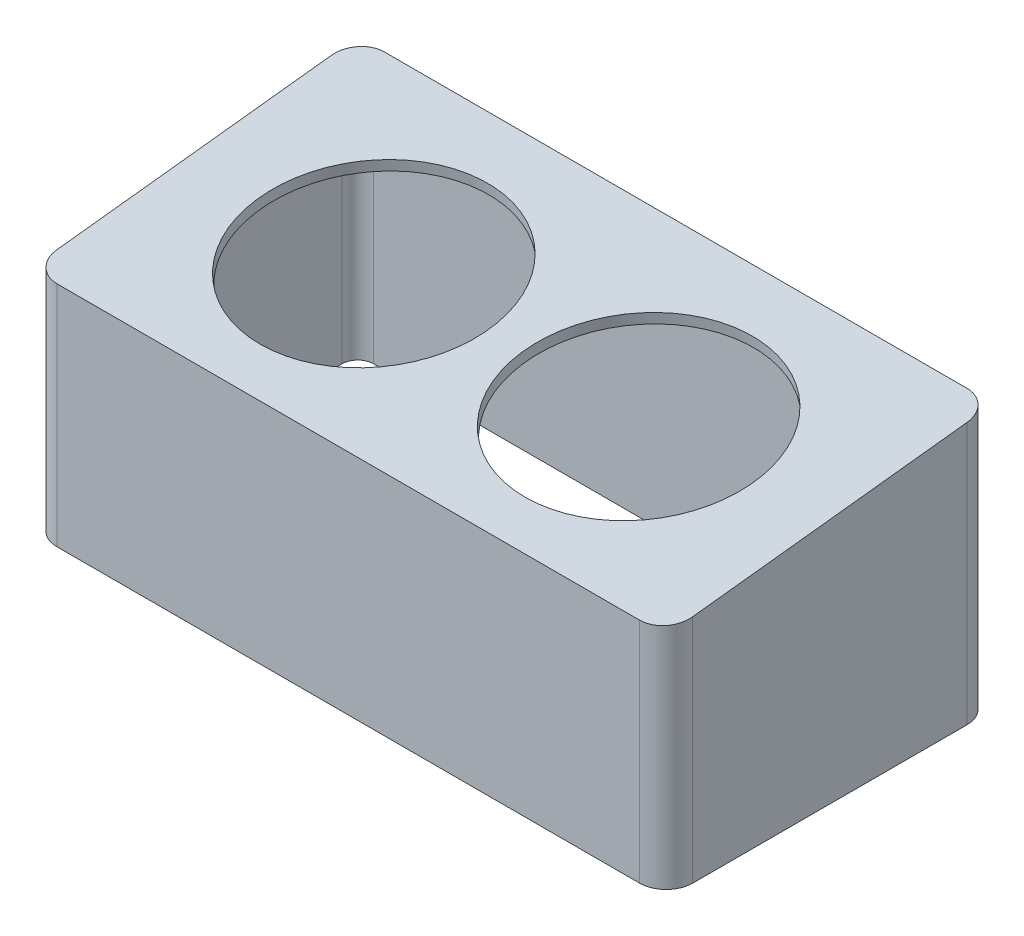
ISO-10303-21;
HEADER;
FILE_DESCRIPTION(('STEP AP214'),'2;1');
FILE_NAME('part.step','',(''),(''),'','','');
FILE_SCHEMA(('AUTOMOTIVE_DESIGN { 1 0 10303 214 1 1 1 1 }'));
ENDSEC;
DATA;
#1=APPLICATION_CONTEXT('core data for automotive mechanical design processes');
#2=APPLICATION_PROTOCOL_DEFINITION('international standard','automotive_design',2000,#1);
#3=PRODUCT_CONTEXT('',#1,'mechanical');
#4=PRODUCT('Part','Part','',(#3));
#5=PRODUCT_RELATED_PRODUCT_CATEGORY('part','',(#4));
#6=PRODUCT_DEFINITION_FORMATION('','',#4);
#7=PRODUCT_DEFINITION_CONTEXT('part definition',#1,'design');
#8=PRODUCT_DEFINITION('design','',#6,#7);
#9=PRODUCT_DEFINITION_SHAPE('','',#8);
#10=(LENGTH_UNIT() NAMED_UNIT(*) SI_UNIT(.MILLI.,.METRE.));
#11=(NAMED_UNIT(*) PLANE_ANGLE_UNIT() SI_UNIT($,.RADIAN.));
#12=(NAMED_UNIT(*) SI_UNIT($,.STERADIAN.) SOLID_ANGLE_UNIT());
#13=UNCERTAINTY_MEASURE_WITH_UNIT(LENGTH_MEASURE(1.E-05),#10,'distance_accuracy_value','');
#14=(GEOMETRIC_REPRESENTATION_CONTEXT(3) GLOBAL_UNCERTAINTY_ASSIGNED_CONTEXT((#13)) GLOBAL_UNIT_ASSIGNED_CONTEXT((#10,
#11,#12)) REPRESENTATION_CONTEXT('',''));
#15=CARTESIAN_POINT('',(0.,0.,0.));
#16=DIRECTION('',(0.,0.,1.));
#17=DIRECTION('',(1.,0.,0.));
#18=AXIS2_PLACEMENT_3D('',#15,#16,#17);
#19=CARTESIAN_POINT('',(74.7417142857143,0.,-25.4850279682198));
#20=DIRECTION('',(0.,-1.,0.));
#21=DIRECTION('',(0.,0.,-1.));
#22=AXIS2_PLACEMENT_3D('',#19,#20,#21);
#23=PLANE('',#22);
#24=DIRECTION('',(1.,0.,0.));
#25=VECTOR('',#24,1.);
#26=CARTESIAN_POINT('',(-35.2582857142857,0.,-30.4850279682198));
#27=LINE('',#26,#25);
#28=CARTESIAN_POINT('',(-35.2582857142857,0.,-30.4850279682198));
#29=VERTEX_POINT('',#28);
#30=CARTESIAN_POINT('',(74.7417142857142,0.,-30.4850279682198));
#31=VERTEX_POINT('',#30);
#32=EDGE_CURVE('E160',#29,#31,#27,.T.);
#33=ORIENTED_EDGE('',*,*,#32,.T.);
#34=CARTESIAN_POINT('',(74.7417142857143,0.,-25.4850279682198));
#35=DIRECTION('',(0.,-1.,0.));
#36=DIRECTION('',(0.,0.,-1.));
#37=AXIS2_PLACEMENT_3D('',#34,#35,#36);
#38=CIRCLE('',#37,5.);
#39=CARTESIAN_POINT('',(79.7417142857143,0.,-25.4850279682198));
#40=VERTEX_POINT('',#39);
#41=EDGE_CURVE('E163',#31,#40,#38,.T.);
#42=ORIENTED_EDGE('',*,*,#41,.T.);
#43=DIRECTION('',(0.,0.,1.));
#44=VECTOR('',#43,1.);
#45=CARTESIAN_POINT('',(79.7417142857143,0.,-25.4850279682198));
#46=LINE('',#45,#44);
#47=CARTESIAN_POINT('',(79.7417142857143,0.,26.3149720317801));
#48=VERTEX_POINT('',#47);
#49=EDGE_CURVE('E167',#40,#48,#46,.T.);
#50=ORIENTED_EDGE('',*,*,#49,.T.);
#51=CARTESIAN_POINT('',(74.7417142857143,0.,26.3149720317802));
#52=DIRECTION('',(0.,1.,0.));
#53=DIRECTION('',(0.,0.,1.));
#54=AXIS2_PLACEMENT_3D('',#51,#52,#53);
#55=CIRCLE('',#54,5.);
#56=CARTESIAN_POINT('',(74.7417142857143,0.,31.3149720317802));
#57=VERTEX_POINT('',#56);
#58=EDGE_CURVE('E171',#57,#48,#55,.T.);
#59=ORIENTED_EDGE('',*,*,#58,.F.);
#60=DIRECTION('',(1.,0.,0.));
#61=VECTOR('',#60,1.);
#62=CARTESIAN_POINT('',(-35.2582857142857,0.,31.3149720317802));
#63=LINE('',#62,#61);
#64=CARTESIAN_POINT('',(-35.2582857142857,0.,31.3149720317802));
#65=VERTEX_POINT('',#64);
#66=EDGE_CURVE('E131',#65,#57,#63,.T.);
#67=ORIENTED_EDGE('',*,*,#66,.F.);
#68=CARTESIAN_POINT('',(-35.2582857142857,0.,26.3149720317802));
#69=DIRECTION('',(0.,1.,0.));
#70=DIRECTION('',(0.,0.,1.));
#71=AXIS2_PLACEMENT_3D('',#68,#69,#70);
#72=CIRCLE('',#71,5.);
#73=CARTESIAN_POINT('',(-40.2582857142857,0.,26.3149720317801));
#74=VERTEX_POINT('',#73);
#75=EDGE_CURVE('E127',#74,#65,#72,.T.);
#76=ORIENTED_EDGE('',*,*,#75,.F.);
#77=DIRECTION('',(0.,0.,1.));
#78=VECTOR('',#77,1.);
#79=CARTESIAN_POINT('',(-40.2582857142857,0.,-25.4850279682198));
#80=LINE('',#79,#78);
#81=CARTESIAN_POINT('',(-40.2582857142857,0.,-25.4850279682198));
#82=VERTEX_POINT('',#81);
#83=EDGE_CURVE('E104',#82,#74,#80,.T.);
#84=ORIENTED_EDGE('',*,*,#83,.F.);
#85=CARTESIAN_POINT('',(-35.2582857142857,0.,-25.4850279682198));
#86=DIRECTION('',(0.,1.,0.));
#87=DIRECTION('',(0.,0.,1.));
#88=AXIS2_PLACEMENT_3D('',#85,#86,#87);
#89=CIRCLE('',#88,5.);
#90=EDGE_CURVE('E115',#29,#82,#89,.T.);
#91=ORIENTED_EDGE('',*,*,#90,.F.);
#92=EDGE_LOOP('',(#33,#42,#50,#59,#67,#76,#84,#91));
#93=FACE_BOUND('',#92,.T.);
#94=DIRECTION('',(1.,0.,0.));
#95=VECTOR('',#94,1.);
#96=CARTESIAN_POINT('',(74.7417142857143,0.,-28.4850279682198));
#97=LINE('',#96,#95);
#98=CARTESIAN_POINT('',(-35.2582857142857,0.,-28.4850279682198));
#99=VERTEX_POINT('',#98);
#100=CARTESIAN_POINT('',(74.7417142857142,0.,-28.4850279682198));
#101=VERTEX_POINT('',#100);
#102=EDGE_CURVE('E251',#99,#101,#97,.T.);
#103=ORIENTED_EDGE('',*,*,#102,.F.);
#104=CARTESIAN_POINT('',(-35.2582857142857,0.,-25.4850279682198));
#105=DIRECTION('',(0.,-1.,0.));
#106=DIRECTION('',(0.,0.,-1.));
#107=AXIS2_PLACEMENT_3D('',#104,#105,#106);
#108=CIRCLE('',#107,3.);
#109=CARTESIAN_POINT('',(-38.2582857142857,0.,-25.4850279682198));
#110=VERTEX_POINT('',#109);
#111=EDGE_CURVE('E230',#99,#110,#108,.F.);
#112=ORIENTED_EDGE('',*,*,#111,.T.);
#113=DIRECTION('',(0.,0.,1.));
#114=VECTOR('',#113,1.);
#115=CARTESIAN_POINT('',(-38.2582857142857,0.,-25.4850279682198));
#116=LINE('',#115,#114);
#117=CARTESIAN_POINT('',(-38.2582857142857,0.,26.3149720317801));
#118=VERTEX_POINT('',#117);
#119=EDGE_CURVE('E61',#110,#118,#116,.T.);
#120=ORIENTED_EDGE('',*,*,#119,.T.);
#121=CARTESIAN_POINT('',(-35.2582857142857,0.,26.3149720317802));
#122=DIRECTION('',(0.,-1.,0.));
#123=DIRECTION('',(0.,0.,-1.));
#124=AXIS2_PLACEMENT_3D('',#121,#122,#123);
#125=CIRCLE('',#124,3.);
#126=CARTESIAN_POINT('',(-35.2582857142857,0.,29.3149720317802));
#127=VERTEX_POINT('',#126);
#128=EDGE_CURVE('E231',#118,#127,#125,.F.);
#129=ORIENTED_EDGE('',*,*,#128,.T.);
#130=DIRECTION('',(1.,0.,0.));
#131=VECTOR('',#130,1.);
#132=CARTESIAN_POINT('',(74.7417142857143,0.,29.3149720317802));
#133=LINE('',#132,#131);
#134=CARTESIAN_POINT('',(74.7417142857143,0.,29.3149720317802));
#135=VERTEX_POINT('',#134);
#136=EDGE_CURVE('E235',#127,#135,#133,.T.);
#137=ORIENTED_EDGE('',*,*,#136,.T.);
#138=CARTESIAN_POINT('',(74.7417142857143,0.,26.3149720317802));
#139=DIRECTION('',(0.,-1.,0.));
#140=DIRECTION('',(0.,0.,-1.));
#141=AXIS2_PLACEMENT_3D('',#138,#139,#140);
#142=CIRCLE('',#141,3.);
#143=CARTESIAN_POINT('',(77.7417142857143,0.,26.3149720317801));
#144=VERTEX_POINT('',#143);
#145=EDGE_CURVE('E239',#135,#144,#142,.F.);
#146=ORIENTED_EDGE('',*,*,#145,.T.);
#147=DIRECTION('',(0.,0.,1.));
#148=VECTOR('',#147,1.);
#149=CARTESIAN_POINT('',(77.7417142857143,0.,-25.4850279682198));
#150=LINE('',#149,#148);
#151=CARTESIAN_POINT('',(77.7417142857143,0.,-25.4850279682198));
#152=VERTEX_POINT('',#151);
#153=EDGE_CURVE('E243',#152,#144,#150,.T.);
#154=ORIENTED_EDGE('',*,*,#153,.F.);
#155=CARTESIAN_POINT('',(74.7417142857143,0.,-25.4850279682198));
#156=DIRECTION('',(0.,-1.,0.));
#157=DIRECTION('',(0.,0.,-1.));
#158=AXIS2_PLACEMENT_3D('',#155,#156,#157);
#159=CIRCLE('',#158,3.);
#160=EDGE_CURVE('E247',#101,#152,#159,.T.);
#161=ORIENTED_EDGE('',*,*,#160,.F.);
#162=EDGE_LOOP('',(#103,#112,#120,#129,#137,#146,#154,#161));
#163=FACE_BOUND('',#162,.T.);
#164=ADVANCED_FACE('F43',(#93,#163),#23,.T.);
#165=CARTESIAN_POINT('',(44.7417142857143,-2.9901694054685,-4.08610378851245));
#166=DIRECTION('',(0.,0.993646184751453,0.112548920602915));
#167=DIRECTION('',(0.,-0.112548920602915,0.993646184751453));
#168=AXIS2_PLACEMENT_3D('',#165,#166,#167);
#169=CYLINDRICAL_SURFACE('',#168,21.6018310876032);
#170=CARTESIAN_POINT('',(44.7417142857143,46.3764676180875,1.50558648923661));
#171=DIRECTION('',(0.,0.993646184751453,0.112548920602915));
#172=DIRECTION('',(0.,-0.112548920602915,0.993646184751453));
#173=AXIS2_PLACEMENT_3D('',#170,#171,#172);
#174=CIRCLE('',#173,21.6018310876032);
#175=CARTESIAN_POINT('',(44.7417142857143,43.9452048461313,22.9701635330788));
#176=VERTEX_POINT('',#175);
#177=EDGE_CURVE('E211',#176,#176,#174,.T.);
#178=ORIENTED_EDGE('',*,*,#177,.T.);
#179=EDGE_LOOP('',(#178));
#180=FACE_BOUND('',#179,.T.);
#181=CARTESIAN_POINT('',(44.7417142857143,44.3891752485846,1.28048864803078));
#182=DIRECTION('',(0.,0.993646184751453,0.112548920602915));
#183=DIRECTION('',(0.,-0.112548920602915,0.993646184751453));
#184=AXIS2_PLACEMENT_3D('',#181,#182,#183);
#185=CIRCLE('',#184,21.6018310876032);
#186=CARTESIAN_POINT('',(44.7417142857143,41.9579124766284,22.745065691873));
#187=VERTEX_POINT('',#186);
#188=EDGE_CURVE('E219',#187,#187,#185,.T.);
#189=ORIENTED_EDGE('',*,*,#188,.F.);
#190=EDGE_LOOP('',(#189));
#191=FACE_BOUND('',#190,.T.);
#192=ADVANCED_FACE('F346',(#180,#191),#169,.F.);
#193=CARTESIAN_POINT('',(-5.25828571428572,-2.99016940546849,-4.08610378851245));
#194=DIRECTION('',(0.,0.993646184751453,0.112548920602915));
#195=DIRECTION('',(0.,-0.112548920602915,0.993646184751453));
#196=AXIS2_PLACEMENT_3D('',#193,#194,#195);
#197=CYLINDRICAL_SURFACE('',#196,21.6018310876032);
#198=CARTESIAN_POINT('',(-5.25828571428572,46.3764676180875,1.50558648923661));
#199=DIRECTION('',(0.,0.993646184751453,0.112548920602915));
#200=DIRECTION('',(0.,-0.112548920602915,0.993646184751453));
#201=AXIS2_PLACEMENT_3D('',#198,#199,#200);
#202=CIRCLE('',#201,21.6018310876032);
#203=CARTESIAN_POINT('',(-5.25828571428572,43.9452048461313,22.9701635330788));
#204=VERTEX_POINT('',#203);
#205=EDGE_CURVE('E210',#204,#204,#202,.T.);
#206=ORIENTED_EDGE('',*,*,#205,.T.);
#207=EDGE_LOOP('',(#206));
#208=FACE_BOUND('',#207,.T.);
#209=CARTESIAN_POINT('',(-5.25828571428572,44.3891752485846,1.28048864803078));
#210=DIRECTION('',(0.,0.993646184751453,0.112548920602915));
#211=DIRECTION('',(0.,-0.112548920602915,0.993646184751453));
#212=AXIS2_PLACEMENT_3D('',#209,#210,#211);
#213=CIRCLE('',#212,21.6018310876032);
#214=CARTESIAN_POINT('',(-5.25828571428572,41.9579124766284,22.745065691873));
#215=VERTEX_POINT('',#214);
#216=EDGE_CURVE('E223',#215,#215,#213,.T.);
#217=ORIENTED_EDGE('',*,*,#216,.F.);
#218=EDGE_LOOP('',(#217));
#219=FACE_BOUND('',#218,.T.);
#220=ADVANCED_FACE('F351',(#208,#219),#197,.F.);
#221=CARTESIAN_POINT('',(-35.2582857142857,50.,-25.4850279682198));
#222=DIRECTION('',(0.,-1.,0.));
#223=DIRECTION('',(0.,0.,-1.));
#224=AXIS2_PLACEMENT_3D('',#221,#222,#223);
#225=CYLINDRICAL_SURFACE('',#224,5.);
#226=CARTESIAN_POINT('',(-35.2582857142857,49.4336569579288,-25.4850279682198));
#227=DIRECTION('',(0.,0.993646184751453,0.112548920602915));
#228=DIRECTION('',(0.,-0.112548920602915,0.993646184751453));
#229=AXIS2_PLACEMENT_3D('',#226,#227,#228);
#230=ELLIPSE('',#229,5.03197222183335,5.);
#231=CARTESIAN_POINT('',(-35.2582857142857,50.,-30.4850279682198));
#232=VERTEX_POINT('',#231);
#233=CARTESIAN_POINT('',(-40.2582857142857,49.4336569579288,-25.4850279682198));
#234=VERTEX_POINT('',#233);
#235=EDGE_CURVE('E158',#232,#234,#230,.T.);
#236=ORIENTED_EDGE('',*,*,#235,.F.);
#237=DIRECTION('',(0.,-1.,0.));
#238=VECTOR('',#237,1.);
#239=CARTESIAN_POINT('',(-35.2582857142857,50.,-30.4850279682198));
#240=LINE('',#239,#238);
#241=EDGE_CURVE('E11',#232,#29,#240,.T.);
#242=ORIENTED_EDGE('',*,*,#241,.T.);
#243=ORIENTED_EDGE('',*,*,#90,.T.);
#244=DIRECTION('',(0.,-1.,0.));
#245=VECTOR('',#244,1.);
#246=CARTESIAN_POINT('',(-40.2582857142857,50.,-25.4850279682198));
#247=LINE('',#246,#245);
#248=EDGE_CURVE('E53',#234,#82,#247,.T.);
#249=ORIENTED_EDGE('',*,*,#248,.F.);
#250=EDGE_LOOP('',(#236,#242,#243,#249));
#251=FACE_BOUND('',#250,.T.);
#252=ADVANCED_FACE('F116',(#251),#225,.T.);
#253=CARTESIAN_POINT('',(-40.2582857142857,50.,-25.4850279682198));
#254=DIRECTION('',(1.,0.,0.));
#255=DIRECTION('',(0.,0.,-1.));
#256=AXIS2_PLACEMENT_3D('',#253,#254,#255);
#257=PLANE('',#256);
#258=DIRECTION('',(0.,-0.112548920602915,0.993646184751453));
#259=VECTOR('',#258,1.);
#260=CARTESIAN_POINT('',(-40.2582857142857,50.,-30.4850279682198));
#261=LINE('',#260,#259);
#262=CARTESIAN_POINT('',(-40.2582857142857,43.5663430420712,26.3149720317802));
#263=VERTEX_POINT('',#262);
#264=EDGE_CURVE('E108',#234,#263,#261,.T.);
#265=ORIENTED_EDGE('',*,*,#264,.F.);
#266=ORIENTED_EDGE('',*,*,#248,.T.);
#267=ORIENTED_EDGE('',*,*,#83,.T.);
#268=DIRECTION('',(0.,-1.,0.));
#269=VECTOR('',#268,1.);
#270=CARTESIAN_POINT('',(-40.2582857142857,50.,26.3149720317801));
#271=LINE('',#270,#269);
#272=EDGE_CURVE('E112',#263,#74,#271,.T.);
#273=ORIENTED_EDGE('',*,*,#272,.F.);
#274=EDGE_LOOP('',(#265,#266,#267,#273));
#275=FACE_BOUND('',#274,.T.);
#276=ADVANCED_FACE('F101',(#275),#257,.F.);
#277=CARTESIAN_POINT('',(-35.2582857142857,50.,26.3149720317802));
#278=DIRECTION('',(0.,-1.,0.));
#279=DIRECTION('',(0.,0.,-1.));
#280=AXIS2_PLACEMENT_3D('',#277,#278,#279);
#281=CYLINDRICAL_SURFACE('',#280,5.);
#282=CARTESIAN_POINT('',(-35.2582857142857,43.5663430420712,26.3149720317802));
#283=DIRECTION('',(0.,0.993646184751453,0.112548920602915));
#284=DIRECTION('',(0.,-0.112548920602915,0.993646184751453));
#285=AXIS2_PLACEMENT_3D('',#282,#283,#284);
#286=ELLIPSE('',#285,5.03197222183335,5.);
#287=CARTESIAN_POINT('',(-35.2582857142857,43.,31.3149720317802));
#288=VERTEX_POINT('',#287);
#289=EDGE_CURVE('E195',#263,#288,#286,.T.);
#290=ORIENTED_EDGE('',*,*,#289,.F.);
#291=ORIENTED_EDGE('',*,*,#272,.T.);
#292=ORIENTED_EDGE('',*,*,#75,.T.);
#293=DIRECTION('',(0.,-1.,0.));
#294=VECTOR('',#293,1.);
#295=CARTESIAN_POINT('',(-35.2582857142857,50.,31.3149720317802));
#296=LINE('',#295,#294);
#297=EDGE_CURVE('E137',#288,#65,#296,.T.);
#298=ORIENTED_EDGE('',*,*,#297,.F.);
#299=EDGE_LOOP('',(#290,#291,#292,#298));
#300=FACE_BOUND('',#299,.T.);
#301=ADVANCED_FACE('F360',(#300),#281,.T.);
#302=CARTESIAN_POINT('',(-35.2582857142857,50.,31.3149720317802));
#303=DIRECTION('',(0.,0.,-1.));
#304=DIRECTION('',(-1.,0.,0.));
#305=AXIS2_PLACEMENT_3D('',#302,#303,#304);
#306=PLANE('',#305);
#307=DIRECTION('',(1.,0.,0.));
#308=VECTOR('',#307,1.);
#309=CARTESIAN_POINT('',(-40.2582857142857,43.,31.3149720317802));
#310=LINE('',#309,#308);
#311=CARTESIAN_POINT('',(74.7417142857143,43.,31.3149720317802));
#312=VERTEX_POINT('',#311);
#313=EDGE_CURVE('E205',#288,#312,#310,.T.);
#314=ORIENTED_EDGE('',*,*,#313,.F.);
#315=ORIENTED_EDGE('',*,*,#297,.T.);
#316=ORIENTED_EDGE('',*,*,#66,.T.);
#317=DIRECTION('',(0.,-1.,0.));
#318=VECTOR('',#317,1.);
#319=CARTESIAN_POINT('',(74.7417142857143,50.,31.3149720317802));
#320=LINE('',#319,#318);
#321=EDGE_CURVE('E140',#312,#57,#320,.T.);
#322=ORIENTED_EDGE('',*,*,#321,.F.);
#323=EDGE_LOOP('',(#314,#315,#316,#322));
#324=FACE_BOUND('',#323,.T.);
#325=ADVANCED_FACE('F180',(#324),#306,.F.);
#326=CARTESIAN_POINT('',(74.7417142857143,50.,26.3149720317802));
#327=DIRECTION('',(0.,-1.,0.));
#328=DIRECTION('',(0.,0.,-1.));
#329=AXIS2_PLACEMENT_3D('',#326,#327,#328);
#330=CYLINDRICAL_SURFACE('',#329,5.);
#331=CARTESIAN_POINT('',(74.7417142857143,43.5663430420712,26.3149720317802));
#332=DIRECTION('',(0.,0.993646184751453,0.112548920602915));
#333=DIRECTION('',(0.,-0.112548920602915,0.993646184751453));
#334=AXIS2_PLACEMENT_3D('',#331,#332,#333);
#335=ELLIPSE('',#334,5.03197222183335,5.);
#336=CARTESIAN_POINT('',(79.7417142857143,43.5663430420712,26.3149720317801));
#337=VERTEX_POINT('',#336);
#338=EDGE_CURVE('E188',#312,#337,#335,.T.);
#339=ORIENTED_EDGE('',*,*,#338,.F.);
#340=ORIENTED_EDGE('',*,*,#321,.T.);
#341=ORIENTED_EDGE('',*,*,#58,.T.);
#342=DIRECTION('',(0.,-1.,0.));
#343=VECTOR('',#342,1.);
#344=CARTESIAN_POINT('',(79.7417142857143,50.,26.3149720317801));
#345=LINE('',#344,#343);
#346=EDGE_CURVE('E143',#337,#48,#345,.T.);
#347=ORIENTED_EDGE('',*,*,#346,.F.);
#348=EDGE_LOOP('',(#339,#340,#341,#347));
#349=FACE_BOUND('',#348,.T.);
#350=ADVANCED_FACE('F186',(#349),#330,.T.);
#351=CARTESIAN_POINT('',(79.7417142857143,50.,-25.4850279682198));
#352=DIRECTION('',(1.,0.,0.));
#353=DIRECTION('',(0.,0.,-1.));
#354=AXIS2_PLACEMENT_3D('',#351,#352,#353);
#355=PLANE('',#354);
#356=DIRECTION('',(0.,-1.,0.));
#357=VECTOR('',#356,1.);
#358=CARTESIAN_POINT('',(79.7417142857143,50.,-25.4850279682198));
#359=LINE('',#358,#357);
#360=CARTESIAN_POINT('',(79.7417142857143,49.4336569579288,-25.4850279682198));
#361=VERTEX_POINT('',#360);
#362=EDGE_CURVE('E145',#361,#40,#359,.T.);
#363=ORIENTED_EDGE('',*,*,#362,.F.);
#364=DIRECTION('',(0.,-0.112548920602915,0.993646184751453));
#365=VECTOR('',#364,1.);
#366=CARTESIAN_POINT('',(79.7417142857143,49.4408309722251,-25.5483642658642));
#367=LINE('',#366,#365);
#368=EDGE_CURVE('E196',#361,#337,#367,.T.);
#369=ORIENTED_EDGE('',*,*,#368,.T.);
#370=ORIENTED_EDGE('',*,*,#346,.T.);
#371=ORIENTED_EDGE('',*,*,#49,.F.);
#372=EDGE_LOOP('',(#363,#369,#370,#371));
#373=FACE_BOUND('',#372,.T.);
#374=ADVANCED_FACE('F368',(#373),#355,.T.);
#375=CARTESIAN_POINT('',(74.7417142857143,50.,-25.4850279682198));
#376=DIRECTION('',(0.,-1.,0.));
#377=DIRECTION('',(0.,0.,-1.));
#378=AXIS2_PLACEMENT_3D('',#375,#376,#377);
#379=CYLINDRICAL_SURFACE('',#378,5.);
#380=DIRECTION('',(0.,-1.,0.));
#381=VECTOR('',#380,1.);
#382=CARTESIAN_POINT('',(74.7417142857142,50.,-30.4850279682198));
#383=LINE('',#382,#381);
#384=CARTESIAN_POINT('',(74.7417142857142,50.,-30.4850279682198));
#385=VERTEX_POINT('',#384);
#386=EDGE_CURVE('E47',#385,#31,#383,.T.);
#387=ORIENTED_EDGE('',*,*,#386,.F.);
#388=CARTESIAN_POINT('',(74.7417142857143,49.4336569579288,-25.4850279682198));
#389=DIRECTION('',(0.,0.993646184751453,0.112548920602915));
#390=DIRECTION('',(0.,-0.112548920602915,0.993646184751453));
#391=AXIS2_PLACEMENT_3D('',#388,#389,#390);
#392=ELLIPSE('',#391,5.03197222183335,5.);
#393=EDGE_CURVE('E70',#385,#361,#392,.F.);
#394=ORIENTED_EDGE('',*,*,#393,.T.);
#395=ORIENTED_EDGE('',*,*,#362,.T.);
#396=ORIENTED_EDGE('',*,*,#41,.F.);
#397=EDGE_LOOP('',(#387,#394,#395,#396));
#398=FACE_BOUND('',#397,.T.);
#399=ADVANCED_FACE('F370',(#398),#379,.T.);
#400=CARTESIAN_POINT('',(-35.2582857142857,50.,-30.4850279682198));
#401=DIRECTION('',(0.,0.,-1.));
#402=DIRECTION('',(-1.,0.,0.));
#403=AXIS2_PLACEMENT_3D('',#400,#401,#402);
#404=PLANE('',#403);
#405=ORIENTED_EDGE('',*,*,#32,.F.);
#406=ORIENTED_EDGE('',*,*,#241,.F.);
#407=DIRECTION('',(1.,0.,0.));
#408=VECTOR('',#407,1.);
#409=CARTESIAN_POINT('',(-35.2582857142857,50.,-30.4850279682198));
#410=LINE('',#409,#408);
#411=EDGE_CURVE('E122',#232,#385,#410,.T.);
#412=ORIENTED_EDGE('',*,*,#411,.T.);
#413=ORIENTED_EDGE('',*,*,#386,.T.);
#414=EDGE_LOOP('',(#405,#406,#412,#413));
#415=FACE_BOUND('',#414,.T.);
#416=ADVANCED_FACE('F45',(#415),#404,.T.);
#417=CARTESIAN_POINT('',(-40.2582857142857,50.,-30.4850279682198));
#418=DIRECTION('',(0.,0.993646184751453,0.112548920602915));
#419=DIRECTION('',(0.,-0.112548920602915,0.993646184751453));
#420=AXIS2_PLACEMENT_3D('',#417,#418,#419);
#421=PLANE('',#420);
#422=ORIENTED_EDGE('',*,*,#205,.F.);
#423=EDGE_LOOP('',(#422));
#424=FACE_BOUND('',#423,.T.);
#425=ORIENTED_EDGE('',*,*,#177,.F.);
#426=EDGE_LOOP('',(#425));
#427=FACE_BOUND('',#426,.T.);
#428=ORIENTED_EDGE('',*,*,#235,.T.);
#429=ORIENTED_EDGE('',*,*,#264,.T.);
#430=ORIENTED_EDGE('',*,*,#289,.T.);
#431=ORIENTED_EDGE('',*,*,#313,.T.);
#432=ORIENTED_EDGE('',*,*,#338,.T.);
#433=ORIENTED_EDGE('',*,*,#368,.F.);
#434=ORIENTED_EDGE('',*,*,#393,.F.);
#435=ORIENTED_EDGE('',*,*,#411,.F.);
#436=EDGE_LOOP('',(#428,#429,#430,#431,#432,#433,#434,#435));
#437=FACE_BOUND('',#436,.T.);
#438=ADVANCED_FACE('F343',(#424,#427,#437),#421,.T.);
#439=CARTESIAN_POINT('',(-35.2582857142857,50.,-25.4850279682198));
#440=DIRECTION('',(0.,-1.,0.));
#441=DIRECTION('',(0.,0.,-1.));
#442=AXIS2_PLACEMENT_3D('',#439,#440,#441);
#443=CYLINDRICAL_SURFACE('',#442,3.);
#444=CARTESIAN_POINT('',(-35.2582857142857,47.4208680691955,-25.4850279682198));
#445=DIRECTION('',(0.,0.993646184751453,0.112548920602915));
#446=DIRECTION('',(0.,-0.112548920602915,0.993646184751453));
#447=AXIS2_PLACEMENT_3D('',#444,#445,#446);
#448=ELLIPSE('',#447,3.01918333310001,3.);
#449=CARTESIAN_POINT('',(-35.2582857142857,47.7606738944382,-28.4850279682198));
#450=VERTEX_POINT('',#449);
#451=CARTESIAN_POINT('',(-38.2582857142857,47.4208680691955,-25.4850279682198));
#452=VERTEX_POINT('',#451);
#453=EDGE_CURVE('E255',#450,#452,#448,.T.);
#454=ORIENTED_EDGE('',*,*,#453,.T.);
#455=DIRECTION('',(0.,1.,0.));
#456=VECTOR('',#455,1.);
#457=CARTESIAN_POINT('',(-38.2582857142857,50.,-25.4850279682198));
#458=LINE('',#457,#456);
#459=EDGE_CURVE('E306',#452,#110,#458,.F.);
#460=ORIENTED_EDGE('',*,*,#459,.T.);
#461=ORIENTED_EDGE('',*,*,#111,.F.);
#462=DIRECTION('',(0.,-1.,0.));
#463=VECTOR('',#462,1.);
#464=CARTESIAN_POINT('',(-35.2582857142857,50.,-28.4850279682198));
#465=LINE('',#464,#463);
#466=EDGE_CURVE('E215',#450,#99,#465,.T.);
#467=ORIENTED_EDGE('',*,*,#466,.F.);
#468=EDGE_LOOP('',(#454,#460,#461,#467));
#469=FACE_BOUND('',#468,.T.);
#470=ADVANCED_FACE('F322',(#469),#443,.F.);
#471=CARTESIAN_POINT('',(-38.2582857142857,50.,-25.4850279682198));
#472=DIRECTION('',(1.,0.,0.));
#473=DIRECTION('',(0.,0.,-1.));
#474=AXIS2_PLACEMENT_3D('',#471,#472,#473);
#475=PLANE('',#474);
#476=DIRECTION('',(0.,-0.112548920602915,0.993646184751453));
#477=VECTOR('',#476,1.);
#478=CARTESIAN_POINT('',(-38.2582857142857,47.4535386027222,-25.77346210707));
#479=LINE('',#478,#477);
#480=CARTESIAN_POINT('',(-38.2582857142857,41.5535541533379,26.3149720317801));
#481=VERTEX_POINT('',#480);
#482=EDGE_CURVE('E227',#452,#481,#479,.T.);
#483=ORIENTED_EDGE('',*,*,#482,.T.);
#484=DIRECTION('',(0.,-1.,0.));
#485=VECTOR('',#484,1.);
#486=CARTESIAN_POINT('',(-38.2582857142857,50.,26.3149720317801));
#487=LINE('',#486,#485);
#488=EDGE_CURVE('E300',#481,#118,#487,.T.);
#489=ORIENTED_EDGE('',*,*,#488,.T.);
#490=ORIENTED_EDGE('',*,*,#119,.F.);
#491=ORIENTED_EDGE('',*,*,#459,.F.);
#492=EDGE_LOOP('',(#483,#489,#490,#491));
#493=FACE_BOUND('',#492,.T.);
#494=ADVANCED_FACE('F332',(#493),#475,.T.);
#495=CARTESIAN_POINT('',(-35.2582857142857,50.,26.3149720317802));
#496=DIRECTION('',(0.,-1.,0.));
#497=DIRECTION('',(0.,0.,-1.));
#498=AXIS2_PLACEMENT_3D('',#495,#496,#497);
#499=CYLINDRICAL_SURFACE('',#498,3.);
#500=CARTESIAN_POINT('',(-35.2582857142857,41.5535541533379,26.3149720317802));
#501=DIRECTION('',(0.,0.993646184751453,0.112548920602915));
#502=DIRECTION('',(0.,-0.112548920602915,0.993646184751453));
#503=AXIS2_PLACEMENT_3D('',#500,#501,#502);
#504=ELLIPSE('',#503,3.01918333310001,3.);
#505=CARTESIAN_POINT('',(-35.2582857142857,41.2137483280952,29.3149720317802));
#506=VERTEX_POINT('',#505);
#507=EDGE_CURVE('E289',#481,#506,#504,.T.);
#508=ORIENTED_EDGE('',*,*,#507,.T.);
#509=DIRECTION('',(0.,1.,0.));
#510=VECTOR('',#509,1.);
#511=CARTESIAN_POINT('',(-35.2582857142857,50.,29.3149720317802));
#512=LINE('',#511,#510);
#513=EDGE_CURVE('E293',#506,#127,#512,.F.);
#514=ORIENTED_EDGE('',*,*,#513,.T.);
#515=ORIENTED_EDGE('',*,*,#128,.F.);
#516=ORIENTED_EDGE('',*,*,#488,.F.);
#517=EDGE_LOOP('',(#508,#514,#515,#516));
#518=FACE_BOUND('',#517,.T.);
#519=ADVANCED_FACE('F334',(#518),#499,.F.);
#520=CARTESIAN_POINT('',(-35.2582857142857,50.,29.3149720317802));
#521=DIRECTION('',(0.,0.,-1.));
#522=DIRECTION('',(-1.,0.,0.));
#523=AXIS2_PLACEMENT_3D('',#520,#521,#522);
#524=PLANE('',#523);
#525=DIRECTION('',(1.,0.,0.));
#526=VECTOR('',#525,1.);
#527=CARTESIAN_POINT('',(-35.2582857142857,41.2137483280952,29.3149720317802));
#528=LINE('',#527,#526);
#529=CARTESIAN_POINT('',(74.7417142857143,41.2137483280952,29.3149720317802));
#530=VERTEX_POINT('',#529);
#531=EDGE_CURVE('E269',#506,#530,#528,.T.);
#532=ORIENTED_EDGE('',*,*,#531,.T.);
#533=DIRECTION('',(0.,-1.,0.));
#534=VECTOR('',#533,1.);
#535=CARTESIAN_POINT('',(74.7417142857143,50.,29.3149720317802));
#536=LINE('',#535,#534);
#537=EDGE_CURVE('E285',#530,#135,#536,.T.);
#538=ORIENTED_EDGE('',*,*,#537,.T.);
#539=ORIENTED_EDGE('',*,*,#136,.F.);
#540=ORIENTED_EDGE('',*,*,#513,.F.);
#541=EDGE_LOOP('',(#532,#538,#539,#540));
#542=FACE_BOUND('',#541,.T.);
#543=ADVANCED_FACE('F340',(#542),#524,.T.);
#544=CARTESIAN_POINT('',(74.7417142857143,50.,26.3149720317802));
#545=DIRECTION('',(0.,-1.,0.));
#546=DIRECTION('',(0.,0.,-1.));
#547=AXIS2_PLACEMENT_3D('',#544,#545,#546);
#548=CYLINDRICAL_SURFACE('',#547,3.);
#549=CARTESIAN_POINT('',(74.7417142857143,41.5535541533379,26.3149720317802));
#550=DIRECTION('',(0.,0.993646184751453,0.112548920602915));
#551=DIRECTION('',(0.,-0.112548920602915,0.993646184751453));
#552=AXIS2_PLACEMENT_3D('',#549,#550,#551);
#553=ELLIPSE('',#552,3.01918333310001,3.);
#554=CARTESIAN_POINT('',(77.7417142857143,41.5535541533379,26.3149720317801));
#555=VERTEX_POINT('',#554);
#556=EDGE_CURVE('E277',#530,#555,#553,.T.);
#557=ORIENTED_EDGE('',*,*,#556,.T.);
#558=DIRECTION('',(0.,1.,0.));
#559=VECTOR('',#558,1.);
#560=CARTESIAN_POINT('',(77.7417142857143,50.,26.3149720317801));
#561=LINE('',#560,#559);
#562=EDGE_CURVE('E281',#555,#144,#561,.F.);
#563=ORIENTED_EDGE('',*,*,#562,.T.);
#564=ORIENTED_EDGE('',*,*,#145,.F.);
#565=ORIENTED_EDGE('',*,*,#537,.F.);
#566=EDGE_LOOP('',(#557,#563,#564,#565));
#567=FACE_BOUND('',#566,.T.);
#568=ADVANCED_FACE('F525',(#567),#548,.F.);
#569=CARTESIAN_POINT('',(77.7417142857143,50.,-25.4850279682198));
#570=DIRECTION('',(1.,0.,0.));
#571=DIRECTION('',(0.,0.,-1.));
#572=AXIS2_PLACEMENT_3D('',#569,#570,#571);
#573=PLANE('',#572);
#574=DIRECTION('',(0.,-1.,0.));
#575=VECTOR('',#574,1.);
#576=CARTESIAN_POINT('',(77.7417142857143,50.,-25.4850279682198));
#577=LINE('',#576,#575);
#578=CARTESIAN_POINT('',(77.7417142857143,47.4208680691955,-25.4850279682198));
#579=VERTEX_POINT('',#578);
#580=EDGE_CURVE('E273',#579,#152,#577,.T.);
#581=ORIENTED_EDGE('',*,*,#580,.T.);
#582=ORIENTED_EDGE('',*,*,#153,.T.);
#583=ORIENTED_EDGE('',*,*,#562,.F.);
#584=DIRECTION('',(0.,-0.112548920602915,0.993646184751453));
#585=VECTOR('',#584,1.);
#586=CARTESIAN_POINT('',(77.7417142857143,47.4535386027222,-25.77346210707));
#587=LINE('',#586,#585);
#588=EDGE_CURVE('E268',#579,#555,#587,.T.);
#589=ORIENTED_EDGE('',*,*,#588,.F.);
#590=EDGE_LOOP('',(#581,#582,#583,#589));
#591=FACE_BOUND('',#590,.T.);
#592=ADVANCED_FACE('F536',(#591),#573,.F.);
#593=CARTESIAN_POINT('',(74.7417142857143,50.,-25.4850279682198));
#594=DIRECTION('',(0.,-1.,0.));
#595=DIRECTION('',(0.,0.,-1.));
#596=AXIS2_PLACEMENT_3D('',#593,#594,#595);
#597=CYLINDRICAL_SURFACE('',#596,3.);
#598=DIRECTION('',(0.,1.,0.));
#599=VECTOR('',#598,1.);
#600=CARTESIAN_POINT('',(74.7417142857142,50.,-28.4850279682198));
#601=LINE('',#600,#599);
#602=CARTESIAN_POINT('',(74.7417142857142,47.7606738944382,-28.4850279682198));
#603=VERTEX_POINT('',#602);
#604=EDGE_CURVE('E263',#603,#101,#601,.F.);
#605=ORIENTED_EDGE('',*,*,#604,.T.);
#606=ORIENTED_EDGE('',*,*,#160,.T.);
#607=ORIENTED_EDGE('',*,*,#580,.F.);
#608=CARTESIAN_POINT('',(74.7417142857143,47.4208680691955,-25.4850279682198));
#609=DIRECTION('',(0.,0.993646184751453,0.112548920602915));
#610=DIRECTION('',(0.,-0.112548920602915,0.993646184751453));
#611=AXIS2_PLACEMENT_3D('',#608,#609,#610);
#612=ELLIPSE('',#611,3.01918333310001,3.);
#613=EDGE_CURVE('E264',#603,#579,#612,.F.);
#614=ORIENTED_EDGE('',*,*,#613,.F.);
#615=EDGE_LOOP('',(#605,#606,#607,#614));
#616=FACE_BOUND('',#615,.T.);
#617=ADVANCED_FACE('F400',(#616),#597,.F.);
#618=CARTESIAN_POINT('',(-35.2582857142857,50.,-28.4850279682198));
#619=DIRECTION('',(0.,0.,-1.));
#620=DIRECTION('',(-1.,0.,0.));
#621=AXIS2_PLACEMENT_3D('',#618,#619,#620);
#622=PLANE('',#621);
#623=ORIENTED_EDGE('',*,*,#102,.T.);
#624=ORIENTED_EDGE('',*,*,#604,.F.);
#625=DIRECTION('',(1.,0.,0.));
#626=VECTOR('',#625,1.);
#627=CARTESIAN_POINT('',(-35.2582857142857,47.7606738944382,-28.4850279682198));
#628=LINE('',#627,#626);
#629=EDGE_CURVE('E259',#450,#603,#628,.T.);
#630=ORIENTED_EDGE('',*,*,#629,.F.);
#631=ORIENTED_EDGE('',*,*,#466,.T.);
#632=EDGE_LOOP('',(#623,#624,#630,#631));
#633=FACE_BOUND('',#632,.T.);
#634=ADVANCED_FACE('F394',(#633),#622,.F.);
#635=CARTESIAN_POINT('',(-40.2582857142857,48.0127076304971,-30.7101258094256));
#636=DIRECTION('',(0.,0.993646184751453,0.112548920602915));
#637=DIRECTION('',(0.,-0.112548920602915,0.993646184751453));
#638=AXIS2_PLACEMENT_3D('',#635,#636,#637);
#639=PLANE('',#638);
#640=ORIENTED_EDGE('',*,*,#216,.T.);
#641=EDGE_LOOP('',(#640));
#642=FACE_BOUND('',#641,.T.);
#643=ORIENTED_EDGE('',*,*,#188,.T.);
#644=EDGE_LOOP('',(#643));
#645=FACE_BOUND('',#644,.T.);
#646=ORIENTED_EDGE('',*,*,#453,.F.);
#647=ORIENTED_EDGE('',*,*,#629,.T.);
#648=ORIENTED_EDGE('',*,*,#613,.T.);
#649=ORIENTED_EDGE('',*,*,#588,.T.);
#650=ORIENTED_EDGE('',*,*,#556,.F.);
#651=ORIENTED_EDGE('',*,*,#531,.F.);
#652=ORIENTED_EDGE('',*,*,#507,.F.);
#653=ORIENTED_EDGE('',*,*,#482,.F.);
#654=EDGE_LOOP('',(#646,#647,#648,#649,#650,#651,#652,#653));
#655=FACE_BOUND('',#654,.T.);
#656=ADVANCED_FACE('F329',(#642,#645,#655),#639,.F.);
#657=CLOSED_SHELL('',(#164,#192,#220,#252,#276,#301,#325,#350,#374,#399,#416,#438,#470,#494,
#519,#543,#568,#592,#617,#634,#656));
#658=MANIFOLD_SOLID_BREP('B2',#657);
#659=ADVANCED_BREP_SHAPE_REPRESENTATION('',(#18,#658),#14);
#660=SHAPE_DEFINITION_REPRESENTATION(#9,#659);
ENDSEC;
END-ISO-10303-21;
